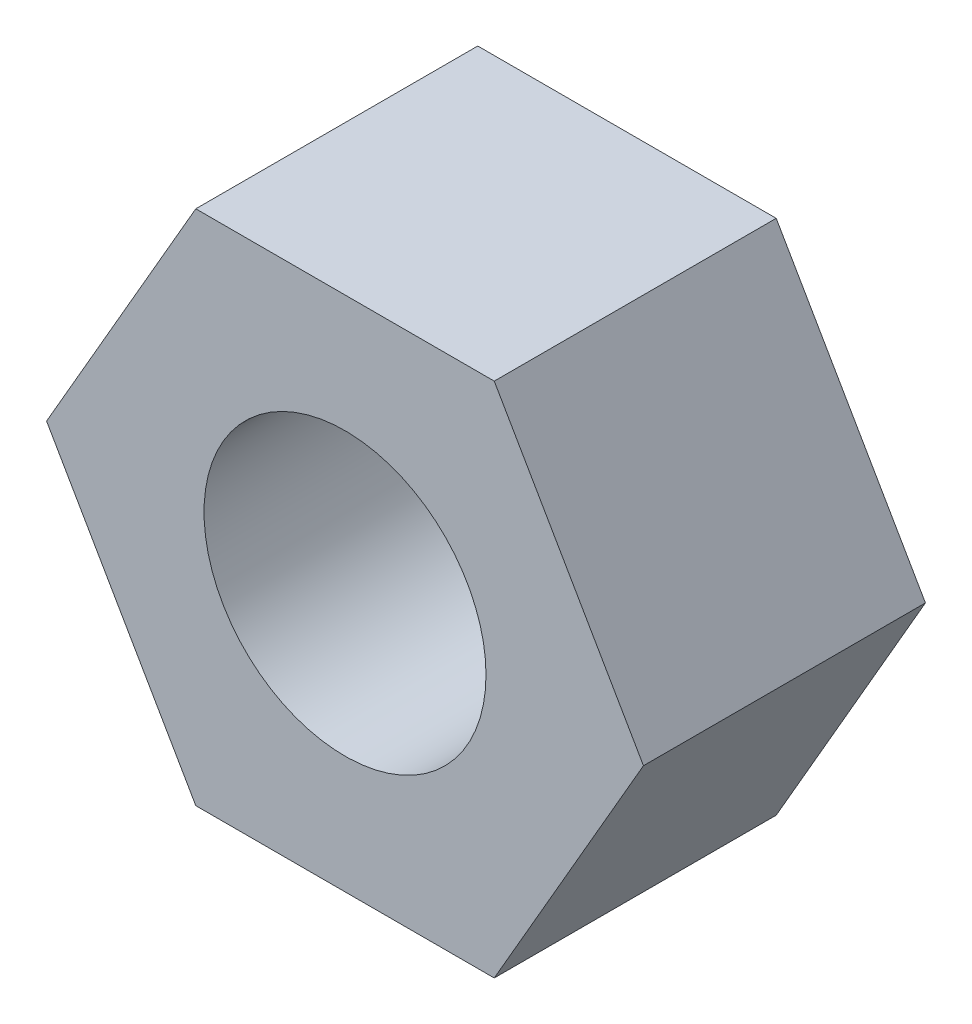
ISO-10303-21;
HEADER;
FILE_DESCRIPTION(('STEP AP214'),'2;1');
FILE_NAME('part.step','',(''),(''),'','','');
FILE_SCHEMA(('AUTOMOTIVE_DESIGN { 1 0 10303 214 1 1 1 1 }'));
ENDSEC;
DATA;
#1=APPLICATION_CONTEXT('core data for automotive mechanical design processes');
#2=APPLICATION_PROTOCOL_DEFINITION('international standard','automotive_design',2000,#1);
#3=PRODUCT_CONTEXT('',#1,'mechanical');
#4=PRODUCT('Part','Part','',(#3));
#5=PRODUCT_RELATED_PRODUCT_CATEGORY('part','',(#4));
#6=PRODUCT_DEFINITION_FORMATION('','',#4);
#7=PRODUCT_DEFINITION_CONTEXT('part definition',#1,'design');
#8=PRODUCT_DEFINITION('design','',#6,#7);
#9=PRODUCT_DEFINITION_SHAPE('','',#8);
#10=(LENGTH_UNIT() NAMED_UNIT(*) SI_UNIT(.MILLI.,.METRE.));
#11=(NAMED_UNIT(*) PLANE_ANGLE_UNIT() SI_UNIT($,.RADIAN.));
#12=(NAMED_UNIT(*) SI_UNIT($,.STERADIAN.) SOLID_ANGLE_UNIT());
#13=UNCERTAINTY_MEASURE_WITH_UNIT(LENGTH_MEASURE(1.E-05),#10,'distance_accuracy_value','');
#14=(GEOMETRIC_REPRESENTATION_CONTEXT(3) GLOBAL_UNCERTAINTY_ASSIGNED_CONTEXT((#13)) GLOBAL_UNIT_ASSIGNED_CONTEXT((#10,
#11,#12)) REPRESENTATION_CONTEXT('',''));
#15=CARTESIAN_POINT('',(0.,0.,0.));
#16=DIRECTION('',(0.,0.,1.));
#17=DIRECTION('',(1.,0.,0.));
#18=AXIS2_PLACEMENT_3D('',#15,#16,#17);
#19=CARTESIAN_POINT('',(0.,0.,3.));
#20=DIRECTION('',(0.,0.,1.));
#21=DIRECTION('',(1.,0.,0.));
#22=AXIS2_PLACEMENT_3D('',#19,#20,#21);
#23=PLANE('',#22);
#24=DIRECTION('',(0.5,0.866025403784438,0.));
#25=VECTOR('',#24,1.);
#26=CARTESIAN_POINT('',(1.58771324027147,-2.75,3.));
#27=LINE('',#26,#25);
#28=CARTESIAN_POINT('',(1.58771324027147,-2.75,3.));
#29=VERTEX_POINT('',#28);
#30=CARTESIAN_POINT('',(3.17542648054294,0.,3.));
#31=VERTEX_POINT('',#30);
#32=EDGE_CURVE('E152',#29,#31,#27,.T.);
#33=ORIENTED_EDGE('',*,*,#32,.T.);
#34=DIRECTION('',(-0.5,0.866025403784438,0.));
#35=VECTOR('',#34,1.);
#36=CARTESIAN_POINT('',(3.17542648054294,0.,3.));
#37=LINE('',#36,#35);
#38=CARTESIAN_POINT('',(1.58771324027147,2.75,3.));
#39=VERTEX_POINT('',#38);
#40=EDGE_CURVE('E100',#31,#39,#37,.T.);
#41=ORIENTED_EDGE('',*,*,#40,.T.);
#42=DIRECTION('',(-1.,0.,0.));
#43=VECTOR('',#42,1.);
#44=CARTESIAN_POINT('',(1.58771324027147,2.75,3.));
#45=LINE('',#44,#43);
#46=CARTESIAN_POINT('',(-1.58771324027147,2.75,3.));
#47=VERTEX_POINT('',#46);
#48=EDGE_CURVE('E113',#39,#47,#45,.T.);
#49=ORIENTED_EDGE('',*,*,#48,.T.);
#50=DIRECTION('',(-0.5,-0.866025403784438,0.));
#51=VECTOR('',#50,1.);
#52=CARTESIAN_POINT('',(-1.58771324027147,2.75,3.));
#53=LINE('',#52,#51);
#54=CARTESIAN_POINT('',(-3.17542648054294,0.,3.));
#55=VERTEX_POINT('',#54);
#56=EDGE_CURVE('E107',#47,#55,#53,.T.);
#57=ORIENTED_EDGE('',*,*,#56,.T.);
#58=DIRECTION('',(0.5,-0.866025403784439,0.));
#59=VECTOR('',#58,1.);
#60=CARTESIAN_POINT('',(-3.17542648054294,0.,3.));
#61=LINE('',#60,#59);
#62=CARTESIAN_POINT('',(-1.58771324027147,-2.75,3.));
#63=VERTEX_POINT('',#62);
#64=EDGE_CURVE('E111',#55,#63,#61,.T.);
#65=ORIENTED_EDGE('',*,*,#64,.T.);
#66=DIRECTION('',(1.,0.,0.));
#67=VECTOR('',#66,1.);
#68=CARTESIAN_POINT('',(-1.58771324027147,-2.75,3.));
#69=LINE('',#68,#67);
#70=EDGE_CURVE('E63',#63,#29,#69,.T.);
#71=ORIENTED_EDGE('',*,*,#70,.T.);
#72=EDGE_LOOP('',(#33,#41,#49,#57,#65,#71));
#73=FACE_BOUND('',#72,.T.);
#74=CARTESIAN_POINT('',(0.,0.,3.));
#75=DIRECTION('',(0.,0.,1.));
#76=DIRECTION('',(1.,0.,0.));
#77=AXIS2_PLACEMENT_3D('',#74,#75,#76);
#78=CIRCLE('',#77,1.5);
#79=CARTESIAN_POINT('',(1.5,0.,3.));
#80=VERTEX_POINT('',#79);
#81=EDGE_CURVE('E140',#80,#80,#78,.T.);
#82=ORIENTED_EDGE('',*,*,#81,.F.);
#83=EDGE_LOOP('',(#82));
#84=FACE_BOUND('',#83,.T.);
#85=ADVANCED_FACE('F45',(#73,#84),#23,.T.);
#86=CARTESIAN_POINT('',(0.,0.,0.));
#87=DIRECTION('',(0.,0.,1.));
#88=DIRECTION('',(1.,0.,0.));
#89=AXIS2_PLACEMENT_3D('',#86,#87,#88);
#90=PLANE('',#89);
#91=DIRECTION('',(0.5,0.866025403784438,0.));
#92=VECTOR('',#91,1.);
#93=CARTESIAN_POINT('',(1.58771324027147,-2.75,0.));
#94=LINE('',#93,#92);
#95=CARTESIAN_POINT('',(1.58771324027147,-2.75,0.));
#96=VERTEX_POINT('',#95);
#97=CARTESIAN_POINT('',(3.17542648054294,0.,0.));
#98=VERTEX_POINT('',#97);
#99=EDGE_CURVE('E135',#96,#98,#94,.T.);
#100=ORIENTED_EDGE('',*,*,#99,.F.);
#101=DIRECTION('',(1.,0.,0.));
#102=VECTOR('',#101,1.);
#103=CARTESIAN_POINT('',(-1.58771324027147,-2.75,0.));
#104=LINE('',#103,#102);
#105=CARTESIAN_POINT('',(-1.58771324027147,-2.75,0.));
#106=VERTEX_POINT('',#105);
#107=EDGE_CURVE('E92',#106,#96,#104,.T.);
#108=ORIENTED_EDGE('',*,*,#107,.F.);
#109=DIRECTION('',(0.5,-0.866025403784439,0.));
#110=VECTOR('',#109,1.);
#111=CARTESIAN_POINT('',(-3.17542648054294,0.,0.));
#112=LINE('',#111,#110);
#113=CARTESIAN_POINT('',(-3.17542648054294,0.,0.));
#114=VERTEX_POINT('',#113);
#115=EDGE_CURVE('E86',#114,#106,#112,.T.);
#116=ORIENTED_EDGE('',*,*,#115,.F.);
#117=DIRECTION('',(-0.5,-0.866025403784438,0.));
#118=VECTOR('',#117,1.);
#119=CARTESIAN_POINT('',(-1.58771324027147,2.75,0.));
#120=LINE('',#119,#118);
#121=CARTESIAN_POINT('',(-1.58771324027147,2.75,0.));
#122=VERTEX_POINT('',#121);
#123=EDGE_CURVE('E122',#122,#114,#120,.T.);
#124=ORIENTED_EDGE('',*,*,#123,.F.);
#125=DIRECTION('',(-1.,0.,0.));
#126=VECTOR('',#125,1.);
#127=CARTESIAN_POINT('',(1.58771324027147,2.75,0.));
#128=LINE('',#127,#126);
#129=CARTESIAN_POINT('',(1.58771324027147,2.75,0.));
#130=VERTEX_POINT('',#129);
#131=EDGE_CURVE('E143',#130,#122,#128,.T.);
#132=ORIENTED_EDGE('',*,*,#131,.F.);
#133=DIRECTION('',(-0.5,0.866025403784438,0.));
#134=VECTOR('',#133,1.);
#135=CARTESIAN_POINT('',(3.17542648054294,0.,0.));
#136=LINE('',#135,#134);
#137=EDGE_CURVE('E139',#98,#130,#136,.T.);
#138=ORIENTED_EDGE('',*,*,#137,.F.);
#139=EDGE_LOOP('',(#100,#108,#116,#124,#132,#138));
#140=FACE_BOUND('',#139,.T.);
#141=CARTESIAN_POINT('',(0.,0.,0.));
#142=DIRECTION('',(0.,0.,1.));
#143=DIRECTION('',(1.,0.,0.));
#144=AXIS2_PLACEMENT_3D('',#141,#142,#143);
#145=CIRCLE('',#144,1.5);
#146=CARTESIAN_POINT('',(1.5,0.,0.));
#147=VERTEX_POINT('',#146);
#148=EDGE_CURVE('E249',#147,#147,#145,.T.);
#149=ORIENTED_EDGE('',*,*,#148,.T.);
#150=EDGE_LOOP('',(#149));
#151=FACE_BOUND('',#150,.T.);
#152=ADVANCED_FACE('F165',(#140,#151),#90,.F.);
#153=CARTESIAN_POINT('',(1.58771324027147,-2.75,3.));
#154=DIRECTION('',(-0.866025403784439,0.5,0.));
#155=DIRECTION('',(-0.5,-0.866025403784439,0.));
#156=AXIS2_PLACEMENT_3D('',#153,#154,#155);
#157=PLANE('',#156);
#158=ORIENTED_EDGE('',*,*,#99,.T.);
#159=DIRECTION('',(0.,0.,-1.));
#160=VECTOR('',#159,1.);
#161=CARTESIAN_POINT('',(3.17542648054294,0.,3.));
#162=LINE('',#161,#160);
#163=EDGE_CURVE('E11',#31,#98,#162,.T.);
#164=ORIENTED_EDGE('',*,*,#163,.F.);
#165=ORIENTED_EDGE('',*,*,#32,.F.);
#166=DIRECTION('',(0.,0.,-1.));
#167=VECTOR('',#166,1.);
#168=CARTESIAN_POINT('',(1.58771324027147,-2.75,3.));
#169=LINE('',#168,#167);
#170=EDGE_CURVE('E131',#29,#96,#169,.T.);
#171=ORIENTED_EDGE('',*,*,#170,.T.);
#172=EDGE_LOOP('',(#158,#164,#165,#171));
#173=FACE_BOUND('',#172,.T.);
#174=ADVANCED_FACE('F47',(#173),#157,.F.);
#175=CARTESIAN_POINT('',(3.17542648054294,0.,3.));
#176=DIRECTION('',(-0.866025403784439,-0.5,0.));
#177=DIRECTION('',(0.5,-0.866025403784439,0.));
#178=AXIS2_PLACEMENT_3D('',#175,#176,#177);
#179=PLANE('',#178);
#180=ORIENTED_EDGE('',*,*,#137,.T.);
#181=DIRECTION('',(0.,0.,-1.));
#182=VECTOR('',#181,1.);
#183=CARTESIAN_POINT('',(1.58771324027147,2.75,3.));
#184=LINE('',#183,#182);
#185=EDGE_CURVE('E55',#39,#130,#184,.T.);
#186=ORIENTED_EDGE('',*,*,#185,.F.);
#187=ORIENTED_EDGE('',*,*,#40,.F.);
#188=ORIENTED_EDGE('',*,*,#163,.T.);
#189=EDGE_LOOP('',(#180,#186,#187,#188));
#190=FACE_BOUND('',#189,.T.);
#191=ADVANCED_FACE('F190',(#190),#179,.F.);
#192=CARTESIAN_POINT('',(1.58771324027147,2.75,3.));
#193=DIRECTION('',(0.,-1.,0.));
#194=DIRECTION('',(0.,0.,-1.));
#195=AXIS2_PLACEMENT_3D('',#192,#193,#194);
#196=PLANE('',#195);
#197=ORIENTED_EDGE('',*,*,#131,.T.);
#198=DIRECTION('',(0.,0.,-1.));
#199=VECTOR('',#198,1.);
#200=CARTESIAN_POINT('',(-1.58771324027147,2.75,3.));
#201=LINE('',#200,#199);
#202=EDGE_CURVE('E124',#47,#122,#201,.T.);
#203=ORIENTED_EDGE('',*,*,#202,.F.);
#204=ORIENTED_EDGE('',*,*,#48,.F.);
#205=ORIENTED_EDGE('',*,*,#185,.T.);
#206=EDGE_LOOP('',(#197,#203,#204,#205));
#207=FACE_BOUND('',#206,.T.);
#208=ADVANCED_FACE('F162',(#207),#196,.F.);
#209=CARTESIAN_POINT('',(-1.58771324027147,2.75,3.));
#210=DIRECTION('',(0.866025403784439,-0.5,0.));
#211=DIRECTION('',(0.5,0.866025403784439,0.));
#212=AXIS2_PLACEMENT_3D('',#209,#210,#211);
#213=PLANE('',#212);
#214=ORIENTED_EDGE('',*,*,#123,.T.);
#215=DIRECTION('',(0.,0.,-1.));
#216=VECTOR('',#215,1.);
#217=CARTESIAN_POINT('',(-3.17542648054294,0.,3.));
#218=LINE('',#217,#216);
#219=EDGE_CURVE('E119',#55,#114,#218,.T.);
#220=ORIENTED_EDGE('',*,*,#219,.F.);
#221=ORIENTED_EDGE('',*,*,#56,.F.);
#222=ORIENTED_EDGE('',*,*,#202,.T.);
#223=EDGE_LOOP('',(#214,#220,#221,#222));
#224=FACE_BOUND('',#223,.T.);
#225=ADVANCED_FACE('F120',(#224),#213,.F.);
#226=CARTESIAN_POINT('',(-3.17542648054294,0.,3.));
#227=DIRECTION('',(0.866025403784438,0.5,0.));
#228=DIRECTION('',(-0.5,0.866025403784439,0.));
#229=AXIS2_PLACEMENT_3D('',#226,#227,#228);
#230=PLANE('',#229);
#231=ORIENTED_EDGE('',*,*,#115,.T.);
#232=DIRECTION('',(0.,0.,-1.));
#233=VECTOR('',#232,1.);
#234=CARTESIAN_POINT('',(-1.58771324027147,-2.75,3.));
#235=LINE('',#234,#233);
#236=EDGE_CURVE('E125',#63,#106,#235,.T.);
#237=ORIENTED_EDGE('',*,*,#236,.F.);
#238=ORIENTED_EDGE('',*,*,#64,.F.);
#239=ORIENTED_EDGE('',*,*,#219,.T.);
#240=EDGE_LOOP('',(#231,#237,#238,#239));
#241=FACE_BOUND('',#240,.T.);
#242=ADVANCED_FACE('F127',(#241),#230,.F.);
#243=CARTESIAN_POINT('',(-1.58771324027147,-2.75,3.));
#244=DIRECTION('',(0.,1.,0.));
#245=DIRECTION('',(-1.,0.,0.));
#246=AXIS2_PLACEMENT_3D('',#243,#244,#245);
#247=PLANE('',#246);
#248=ORIENTED_EDGE('',*,*,#107,.T.);
#249=ORIENTED_EDGE('',*,*,#170,.F.);
#250=ORIENTED_EDGE('',*,*,#70,.F.);
#251=ORIENTED_EDGE('',*,*,#236,.T.);
#252=EDGE_LOOP('',(#248,#249,#250,#251));
#253=FACE_BOUND('',#252,.T.);
#254=ADVANCED_FACE('F170',(#253),#247,.F.);
#255=CARTESIAN_POINT('',(0.,0.,3.));
#256=DIRECTION('',(0.,0.,-1.));
#257=DIRECTION('',(-1.,0.,0.));
#258=AXIS2_PLACEMENT_3D('',#255,#256,#257);
#259=CYLINDRICAL_SURFACE('',#258,1.5);
#260=ORIENTED_EDGE('',*,*,#81,.T.);
#261=EDGE_LOOP('',(#260));
#262=FACE_BOUND('',#261,.T.);
#263=ORIENTED_EDGE('',*,*,#148,.F.);
#264=EDGE_LOOP('',(#263));
#265=FACE_BOUND('',#264,.T.);
#266=ADVANCED_FACE('F172',(#262,#265),#259,.F.);
#267=CLOSED_SHELL('',(#85,#152,#174,#191,#208,#225,#242,#254,#266));
#268=MANIFOLD_SOLID_BREP('B2',#267);
#269=ADVANCED_BREP_SHAPE_REPRESENTATION('',(#18,#268),#14);
#270=SHAPE_DEFINITION_REPRESENTATION(#9,#269);
ENDSEC;
END-ISO-10303-21;
